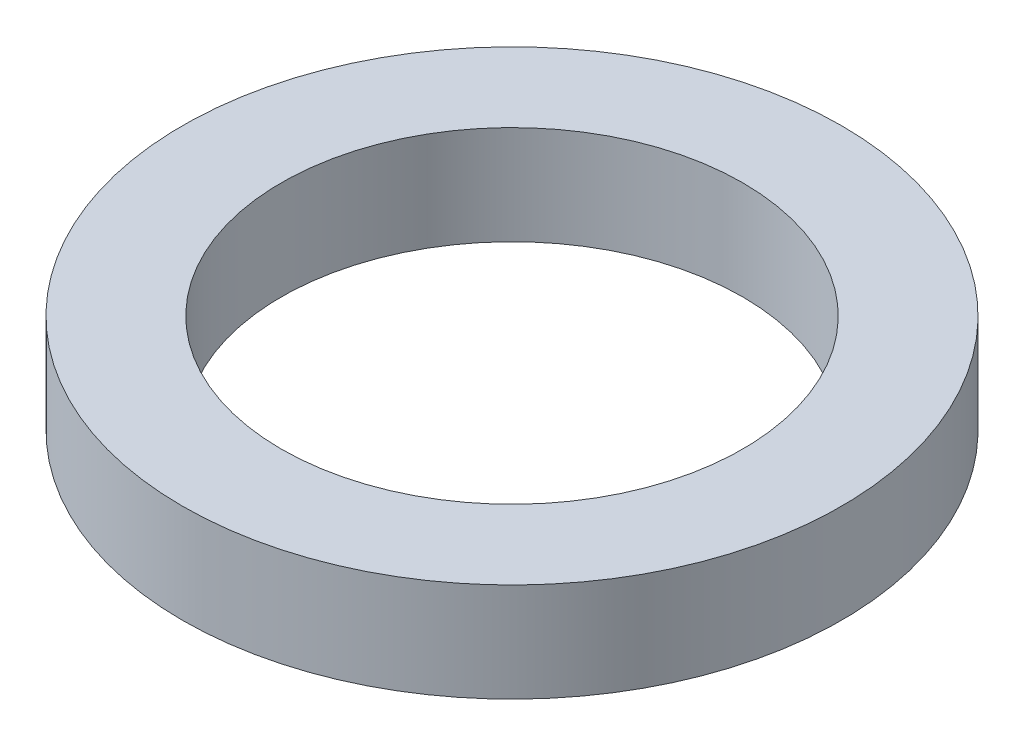
ISO-10303-21;
HEADER;
FILE_DESCRIPTION(('STEP AP214'),'2;1');
FILE_NAME('part.step','',(''),(''),'','','');
FILE_SCHEMA(('AUTOMOTIVE_DESIGN { 1 0 10303 214 1 1 1 1 }'));
ENDSEC;
DATA;
#1=APPLICATION_CONTEXT('core data for automotive mechanical design processes');
#2=APPLICATION_PROTOCOL_DEFINITION('international standard','automotive_design',2000,#1);
#3=PRODUCT_CONTEXT('',#1,'mechanical');
#4=PRODUCT('Part','Part','',(#3));
#5=PRODUCT_RELATED_PRODUCT_CATEGORY('part','',(#4));
#6=PRODUCT_DEFINITION_FORMATION('','',#4);
#7=PRODUCT_DEFINITION_CONTEXT('part definition',#1,'design');
#8=PRODUCT_DEFINITION('design','',#6,#7);
#9=PRODUCT_DEFINITION_SHAPE('','',#8);
#10=(LENGTH_UNIT() NAMED_UNIT(*) SI_UNIT(.MILLI.,.METRE.));
#11=(NAMED_UNIT(*) PLANE_ANGLE_UNIT() SI_UNIT($,.RADIAN.));
#12=(NAMED_UNIT(*) SI_UNIT($,.STERADIAN.) SOLID_ANGLE_UNIT());
#13=UNCERTAINTY_MEASURE_WITH_UNIT(LENGTH_MEASURE(1.E-05),#10,'distance_accuracy_value','');
#14=(GEOMETRIC_REPRESENTATION_CONTEXT(3) GLOBAL_UNCERTAINTY_ASSIGNED_CONTEXT((#13)) GLOBAL_UNIT_ASSIGNED_CONTEXT((#10,
#11,#12)) REPRESENTATION_CONTEXT('',''));
#15=CARTESIAN_POINT('',(0.,0.,0.));
#16=DIRECTION('',(0.,0.,1.));
#17=DIRECTION('',(1.,0.,0.));
#18=AXIS2_PLACEMENT_3D('',#15,#16,#17);
#19=CARTESIAN_POINT('',(-20.,-197.93,-16.57));
#20=DIRECTION('',(0.,-1.,0.));
#21=DIRECTION('',(0.,0.,-1.));
#22=AXIS2_PLACEMENT_3D('',#19,#20,#21);
#23=PLANE('',#22);
#24=CARTESIAN_POINT('',(-20.,-197.93,-16.57));
#25=DIRECTION('',(0.,-1.,0.));
#26=DIRECTION('',(0.,0.,-1.));
#27=AXIS2_PLACEMENT_3D('',#24,#25,#26);
#28=CIRCLE('',#27,10.);
#29=CARTESIAN_POINT('',(-20.,-197.93,-26.57));
#30=VERTEX_POINT('',#29);
#31=EDGE_CURVE('E10',#30,#30,#28,.T.);
#32=ORIENTED_EDGE('',*,*,#31,.T.);
#33=EDGE_LOOP('',(#32));
#34=FACE_BOUND('',#33,.T.);
#35=CARTESIAN_POINT('',(-20.,-197.93,-16.57));
#36=DIRECTION('',(0.,-1.,0.));
#37=DIRECTION('',(0.,0.,-1.));
#38=AXIS2_PLACEMENT_3D('',#35,#36,#37);
#39=CIRCLE('',#38,7.);
#40=CARTESIAN_POINT('',(-20.,-197.93,-23.57));
#41=VERTEX_POINT('',#40);
#42=EDGE_CURVE('E52',#41,#41,#39,.T.);
#43=ORIENTED_EDGE('',*,*,#42,.F.);
#44=EDGE_LOOP('',(#43));
#45=FACE_BOUND('',#44,.T.);
#46=ADVANCED_FACE('F41',(#34,#45),#23,.T.);
#47=CARTESIAN_POINT('',(-20.,-194.93,-16.57));
#48=DIRECTION('',(0.,-1.,0.));
#49=DIRECTION('',(0.,0.,-1.));
#50=AXIS2_PLACEMENT_3D('',#47,#48,#49);
#51=PLANE('',#50);
#52=CARTESIAN_POINT('',(-20.,-194.93,-16.57));
#53=DIRECTION('',(0.,-1.,0.));
#54=DIRECTION('',(0.,0.,-1.));
#55=AXIS2_PLACEMENT_3D('',#52,#53,#54);
#56=CIRCLE('',#55,10.);
#57=CARTESIAN_POINT('',(-20.,-194.93,-26.57));
#58=VERTEX_POINT('',#57);
#59=EDGE_CURVE('E45',#58,#58,#56,.T.);
#60=ORIENTED_EDGE('',*,*,#59,.F.);
#61=EDGE_LOOP('',(#60));
#62=FACE_BOUND('',#61,.T.);
#63=CARTESIAN_POINT('',(-20.,-194.93,-16.57));
#64=DIRECTION('',(0.,-1.,0.));
#65=DIRECTION('',(0.,0.,-1.));
#66=AXIS2_PLACEMENT_3D('',#63,#64,#65);
#67=CIRCLE('',#66,7.);
#68=CARTESIAN_POINT('',(-20.,-194.93,-23.57));
#69=VERTEX_POINT('',#68);
#70=EDGE_CURVE('E54',#69,#69,#67,.T.);
#71=ORIENTED_EDGE('',*,*,#70,.T.);
#72=EDGE_LOOP('',(#71));
#73=FACE_BOUND('',#72,.T.);
#74=ADVANCED_FACE('F64',(#62,#73),#51,.F.);
#75=CARTESIAN_POINT('',(-20.,-197.93,-16.57));
#76=DIRECTION('',(0.,1.,0.));
#77=DIRECTION('',(0.,0.,1.));
#78=AXIS2_PLACEMENT_3D('',#75,#76,#77);
#79=CYLINDRICAL_SURFACE('',#78,10.);
#80=ORIENTED_EDGE('',*,*,#31,.F.);
#81=EDGE_LOOP('',(#80));
#82=FACE_BOUND('',#81,.T.);
#83=ORIENTED_EDGE('',*,*,#59,.T.);
#84=EDGE_LOOP('',(#83));
#85=FACE_BOUND('',#84,.T.);
#86=ADVANCED_FACE('F43',(#82,#85),#79,.T.);
#87=CARTESIAN_POINT('',(-20.,-197.93,-16.57));
#88=DIRECTION('',(0.,1.,0.));
#89=DIRECTION('',(0.,0.,1.));
#90=AXIS2_PLACEMENT_3D('',#87,#88,#89);
#91=CYLINDRICAL_SURFACE('',#90,7.);
#92=ORIENTED_EDGE('',*,*,#42,.T.);
#93=EDGE_LOOP('',(#92));
#94=FACE_BOUND('',#93,.T.);
#95=ORIENTED_EDGE('',*,*,#70,.F.);
#96=EDGE_LOOP('',(#95));
#97=FACE_BOUND('',#96,.T.);
#98=ADVANCED_FACE('F60',(#94,#97),#91,.F.);
#99=CLOSED_SHELL('',(#46,#74,#86,#98));
#100=MANIFOLD_SOLID_BREP('B2',#99);
#101=ADVANCED_BREP_SHAPE_REPRESENTATION('',(#18,#100),#14);
#102=SHAPE_DEFINITION_REPRESENTATION(#9,#101);
ENDSEC;
END-ISO-10303-21;
